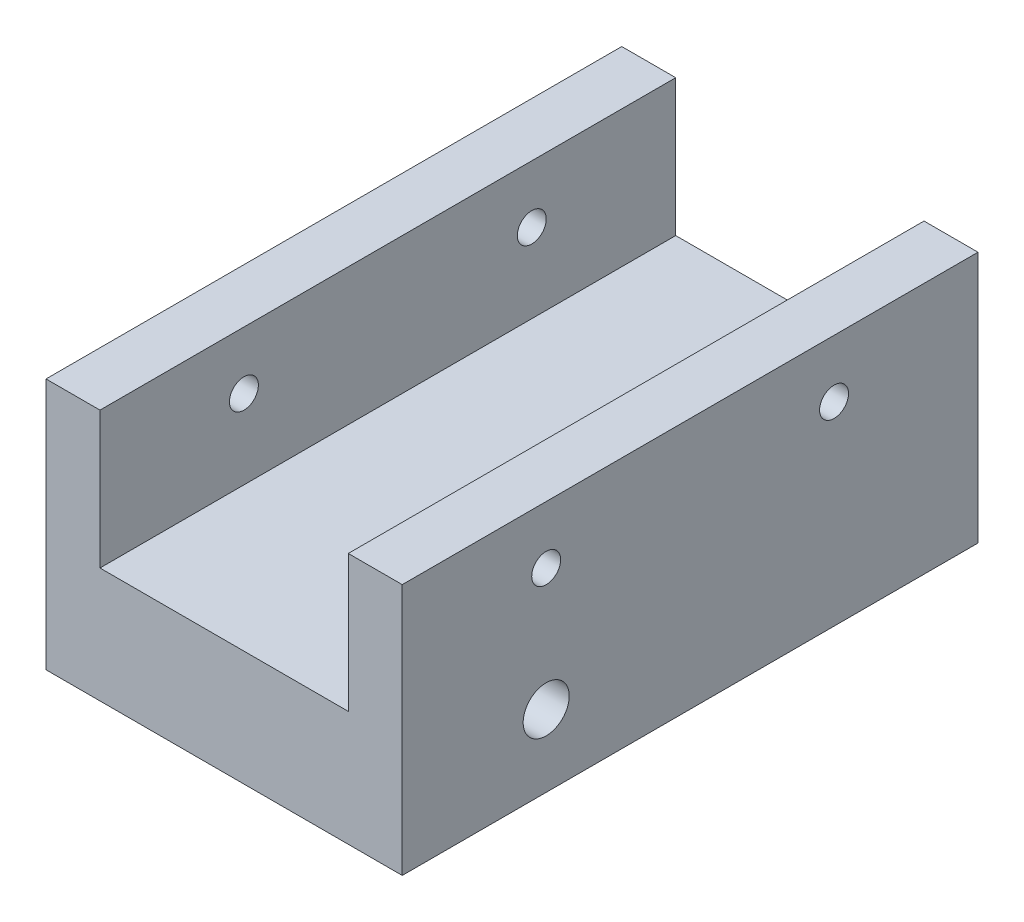
ISO-10303-21;
HEADER;
FILE_DESCRIPTION(('STEP AP214'),'2;1');
FILE_NAME('part.step','',(''),(''),'','','');
FILE_SCHEMA(('AUTOMOTIVE_DESIGN { 1 0 10303 214 1 1 1 1 }'));
ENDSEC;
DATA;
#1=APPLICATION_CONTEXT('core data for automotive mechanical design processes');
#2=APPLICATION_PROTOCOL_DEFINITION('international standard','automotive_design',2000,#1);
#3=PRODUCT_CONTEXT('',#1,'mechanical');
#4=PRODUCT('Part','Part','',(#3));
#5=PRODUCT_RELATED_PRODUCT_CATEGORY('part','',(#4));
#6=PRODUCT_DEFINITION_FORMATION('','',#4);
#7=PRODUCT_DEFINITION_CONTEXT('part definition',#1,'design');
#8=PRODUCT_DEFINITION('design','',#6,#7);
#9=PRODUCT_DEFINITION_SHAPE('','',#8);
#10=(LENGTH_UNIT() NAMED_UNIT(*) SI_UNIT(.MILLI.,.METRE.));
#11=(NAMED_UNIT(*) PLANE_ANGLE_UNIT() SI_UNIT($,.RADIAN.));
#12=(NAMED_UNIT(*) SI_UNIT($,.STERADIAN.) SOLID_ANGLE_UNIT());
#13=UNCERTAINTY_MEASURE_WITH_UNIT(LENGTH_MEASURE(1.E-05),#10,'distance_accuracy_value','');
#14=(GEOMETRIC_REPRESENTATION_CONTEXT(3) GLOBAL_UNCERTAINTY_ASSIGNED_CONTEXT((#13)) GLOBAL_UNIT_ASSIGNED_CONTEXT((#10,
#11,#12)) REPRESENTATION_CONTEXT('',''));
#15=CARTESIAN_POINT('',(0.,0.,0.));
#16=DIRECTION('',(0.,0.,1.));
#17=DIRECTION('',(1.,0.,0.));
#18=AXIS2_PLACEMENT_3D('',#15,#16,#17);
#19=CARTESIAN_POINT('',(0.,44.45,101.6));
#20=DIRECTION('',(1.,0.,0.));
#21=DIRECTION('',(0.,1.,0.));
#22=AXIS2_PLACEMENT_3D('',#19,#20,#21);
#23=PLANE('',#22);
#24=CARTESIAN_POINT('',(0.,12.7,76.2));
#25=DIRECTION('',(-1.,0.,0.));
#26=DIRECTION('',(0.,0.,1.));
#27=AXIS2_PLACEMENT_3D('',#24,#25,#26);
#28=CIRCLE('',#27,4.064);
#29=CARTESIAN_POINT('',(0.,12.7,80.264));
#30=VERTEX_POINT('',#29);
#31=EDGE_CURVE('E218',#30,#30,#28,.T.);
#32=ORIENTED_EDGE('',*,*,#31,.F.);
#33=EDGE_LOOP('',(#32));
#34=FACE_BOUND('',#33,.T.);
#35=CARTESIAN_POINT('',(0.,34.29,25.4));
#36=DIRECTION('',(-1.,0.,0.));
#37=DIRECTION('',(0.,0.,1.));
#38=AXIS2_PLACEMENT_3D('',#35,#36,#37);
#39=CIRCLE('',#38,2.5527);
#40=CARTESIAN_POINT('',(0.,34.29,27.9527));
#41=VERTEX_POINT('',#40);
#42=EDGE_CURVE('E222',#41,#41,#39,.T.);
#43=ORIENTED_EDGE('',*,*,#42,.F.);
#44=EDGE_LOOP('',(#43));
#45=FACE_BOUND('',#44,.T.);
#46=CARTESIAN_POINT('',(0.,34.29,76.2));
#47=DIRECTION('',(-1.,0.,0.));
#48=DIRECTION('',(0.,0.,1.));
#49=AXIS2_PLACEMENT_3D('',#46,#47,#48);
#50=CIRCLE('',#49,2.5527);
#51=CARTESIAN_POINT('',(0.,34.29,78.7527));
#52=VERTEX_POINT('',#51);
#53=EDGE_CURVE('E166',#52,#52,#50,.T.);
#54=ORIENTED_EDGE('',*,*,#53,.F.);
#55=EDGE_LOOP('',(#54));
#56=FACE_BOUND('',#55,.T.);
#57=DIRECTION('',(0.,-1.,0.));
#58=VECTOR('',#57,1.);
#59=CARTESIAN_POINT('',(0.,44.45,0.));
#60=LINE('',#59,#58);
#61=CARTESIAN_POINT('',(0.,44.45,0.));
#62=VERTEX_POINT('',#61);
#63=CARTESIAN_POINT('',(0.,0.,0.));
#64=VERTEX_POINT('',#63);
#65=EDGE_CURVE('E132',#62,#64,#60,.T.);
#66=ORIENTED_EDGE('',*,*,#65,.T.);
#67=DIRECTION('',(0.,0.,-1.));
#68=VECTOR('',#67,1.);
#69=CARTESIAN_POINT('',(0.,0.,101.6));
#70=LINE('',#69,#68);
#71=CARTESIAN_POINT('',(0.,0.,101.6));
#72=VERTEX_POINT('',#71);
#73=EDGE_CURVE('E11',#72,#64,#70,.T.);
#74=ORIENTED_EDGE('',*,*,#73,.F.);
#75=DIRECTION('',(0.,-1.,0.));
#76=VECTOR('',#75,1.);
#77=CARTESIAN_POINT('',(0.,44.45,101.6));
#78=LINE('',#77,#76);
#79=CARTESIAN_POINT('',(0.,44.45,101.6));
#80=VERTEX_POINT('',#79);
#81=EDGE_CURVE('E147',#80,#72,#78,.T.);
#82=ORIENTED_EDGE('',*,*,#81,.F.);
#83=DIRECTION('',(0.,0.,-1.));
#84=VECTOR('',#83,1.);
#85=CARTESIAN_POINT('',(0.,44.45,101.6));
#86=LINE('',#85,#84);
#87=EDGE_CURVE('E128',#80,#62,#86,.T.);
#88=ORIENTED_EDGE('',*,*,#87,.T.);
#89=EDGE_LOOP('',(#66,#74,#82,#88));
#90=FACE_BOUND('',#89,.T.);
#91=ADVANCED_FACE('F34',(#34,#45,#56,#90),#23,.F.);
#92=CARTESIAN_POINT('',(0.,0.,101.6));
#93=DIRECTION('',(0.,1.,0.));
#94=DIRECTION('',(-1.,0.,0.));
#95=AXIS2_PLACEMENT_3D('',#92,#93,#94);
#96=PLANE('',#95);
#97=DIRECTION('',(1.,0.,0.));
#98=VECTOR('',#97,1.);
#99=CARTESIAN_POINT('',(0.,0.,0.));
#100=LINE('',#99,#98);
#101=CARTESIAN_POINT('',(62.865,0.,0.));
#102=VERTEX_POINT('',#101);
#103=EDGE_CURVE('E135',#64,#102,#100,.T.);
#104=ORIENTED_EDGE('',*,*,#103,.T.);
#105=DIRECTION('',(0.,0.,-1.));
#106=VECTOR('',#105,1.);
#107=CARTESIAN_POINT('',(62.865,0.,101.6));
#108=LINE('',#107,#106);
#109=CARTESIAN_POINT('',(62.865,0.,101.6));
#110=VERTEX_POINT('',#109);
#111=EDGE_CURVE('E43',#110,#102,#108,.T.);
#112=ORIENTED_EDGE('',*,*,#111,.F.);
#113=DIRECTION('',(1.,0.,0.));
#114=VECTOR('',#113,1.);
#115=CARTESIAN_POINT('',(0.,0.,101.6));
#116=LINE('',#115,#114);
#117=EDGE_CURVE('E95',#72,#110,#116,.T.);
#118=ORIENTED_EDGE('',*,*,#117,.F.);
#119=ORIENTED_EDGE('',*,*,#73,.T.);
#120=EDGE_LOOP('',(#104,#112,#118,#119));
#121=FACE_BOUND('',#120,.T.);
#122=ADVANCED_FACE('F209',(#121),#96,.F.);
#123=CARTESIAN_POINT('',(62.865,0.,101.6));
#124=DIRECTION('',(-1.,0.,0.));
#125=DIRECTION('',(0.,-1.,0.));
#126=AXIS2_PLACEMENT_3D('',#123,#124,#125);
#127=PLANE('',#126);
#128=CARTESIAN_POINT('',(62.865,12.7,76.2));
#129=DIRECTION('',(-1.,0.,0.));
#130=DIRECTION('',(0.,0.,1.));
#131=AXIS2_PLACEMENT_3D('',#128,#129,#130);
#132=CIRCLE('',#131,4.064);
#133=CARTESIAN_POINT('',(62.865,12.7,80.264));
#134=VERTEX_POINT('',#133);
#135=EDGE_CURVE('E255',#134,#134,#132,.T.);
#136=ORIENTED_EDGE('',*,*,#135,.T.);
#137=EDGE_LOOP('',(#136));
#138=FACE_BOUND('',#137,.T.);
#139=CARTESIAN_POINT('',(62.865,34.29,25.4));
#140=DIRECTION('',(-1.,0.,0.));
#141=DIRECTION('',(0.,0.,1.));
#142=AXIS2_PLACEMENT_3D('',#139,#140,#141);
#143=CIRCLE('',#142,2.55269999999998);
#144=CARTESIAN_POINT('',(62.865,34.29,27.9527));
#145=VERTEX_POINT('',#144);
#146=EDGE_CURVE('E260',#145,#145,#143,.T.);
#147=ORIENTED_EDGE('',*,*,#146,.T.);
#148=EDGE_LOOP('',(#147));
#149=FACE_BOUND('',#148,.T.);
#150=CARTESIAN_POINT('',(62.865,34.29,76.2));
#151=DIRECTION('',(-1.,0.,0.));
#152=DIRECTION('',(0.,0.,1.));
#153=AXIS2_PLACEMENT_3D('',#150,#151,#152);
#154=CIRCLE('',#153,2.55269999999998);
#155=CARTESIAN_POINT('',(62.865,34.29,78.7527));
#156=VERTEX_POINT('',#155);
#157=EDGE_CURVE('E160',#156,#156,#154,.T.);
#158=ORIENTED_EDGE('',*,*,#157,.T.);
#159=EDGE_LOOP('',(#158));
#160=FACE_BOUND('',#159,.T.);
#161=DIRECTION('',(0.,1.,0.));
#162=VECTOR('',#161,1.);
#163=CARTESIAN_POINT('',(62.865,0.,0.));
#164=LINE('',#163,#162);
#165=CARTESIAN_POINT('',(62.865,44.45,0.));
#166=VERTEX_POINT('',#165);
#167=EDGE_CURVE('E138',#102,#166,#164,.T.);
#168=ORIENTED_EDGE('',*,*,#167,.T.);
#169=DIRECTION('',(0.,0.,-1.));
#170=VECTOR('',#169,1.);
#171=CARTESIAN_POINT('',(62.865,44.45,101.6));
#172=LINE('',#171,#170);
#173=CARTESIAN_POINT('',(62.865,44.45,101.6));
#174=VERTEX_POINT('',#173);
#175=EDGE_CURVE('E154',#174,#166,#172,.T.);
#176=ORIENTED_EDGE('',*,*,#175,.F.);
#177=DIRECTION('',(0.,1.,0.));
#178=VECTOR('',#177,1.);
#179=CARTESIAN_POINT('',(62.865,0.,101.6));
#180=LINE('',#179,#178);
#181=EDGE_CURVE('E177',#110,#174,#180,.T.);
#182=ORIENTED_EDGE('',*,*,#181,.F.);
#183=ORIENTED_EDGE('',*,*,#111,.T.);
#184=EDGE_LOOP('',(#168,#176,#182,#183));
#185=FACE_BOUND('',#184,.T.);
#186=ADVANCED_FACE('F214',(#138,#149,#160,#185),#127,.F.);
#187=CARTESIAN_POINT('',(62.865,44.45,101.6));
#188=DIRECTION('',(0.,-1.,0.));
#189=DIRECTION('',(0.,0.,-1.));
#190=AXIS2_PLACEMENT_3D('',#187,#188,#189);
#191=PLANE('',#190);
#192=DIRECTION('',(-1.,0.,0.));
#193=VECTOR('',#192,1.);
#194=CARTESIAN_POINT('',(62.865,44.45,0.));
#195=LINE('',#194,#193);
#196=CARTESIAN_POINT('',(53.34,44.45,0.));
#197=VERTEX_POINT('',#196);
#198=EDGE_CURVE('E140',#166,#197,#195,.T.);
#199=ORIENTED_EDGE('',*,*,#198,.T.);
#200=DIRECTION('',(0.,0.,-1.));
#201=VECTOR('',#200,1.);
#202=CARTESIAN_POINT('',(53.34,44.45,101.6));
#203=LINE('',#202,#201);
#204=CARTESIAN_POINT('',(53.34,44.45,101.6));
#205=VERTEX_POINT('',#204);
#206=EDGE_CURVE('E151',#205,#197,#203,.T.);
#207=ORIENTED_EDGE('',*,*,#206,.F.);
#208=DIRECTION('',(-1.,0.,0.));
#209=VECTOR('',#208,1.);
#210=CARTESIAN_POINT('',(62.865,44.45,101.6));
#211=LINE('',#210,#209);
#212=EDGE_CURVE('E179',#174,#205,#211,.T.);
#213=ORIENTED_EDGE('',*,*,#212,.F.);
#214=ORIENTED_EDGE('',*,*,#175,.T.);
#215=EDGE_LOOP('',(#199,#207,#213,#214));
#216=FACE_BOUND('',#215,.T.);
#217=ADVANCED_FACE('F185',(#216),#191,.F.);
#218=CARTESIAN_POINT('',(53.34,44.45,101.6));
#219=DIRECTION('',(1.,0.,0.));
#220=DIRECTION('',(0.,0.,-1.));
#221=AXIS2_PLACEMENT_3D('',#218,#219,#220);
#222=PLANE('',#221);
#223=CARTESIAN_POINT('',(53.34,34.29,25.4));
#224=DIRECTION('',(1.,0.,0.));
#225=DIRECTION('',(0.,0.,-1.));
#226=AXIS2_PLACEMENT_3D('',#223,#224,#225);
#227=CIRCLE('',#226,2.55269999999999);
#228=CARTESIAN_POINT('',(53.34,34.29,22.8473));
#229=VERTEX_POINT('',#228);
#230=EDGE_CURVE('E37',#229,#229,#227,.T.);
#231=ORIENTED_EDGE('',*,*,#230,.T.);
#232=EDGE_LOOP('',(#231));
#233=FACE_BOUND('',#232,.T.);
#234=CARTESIAN_POINT('',(53.34,34.29,76.2));
#235=DIRECTION('',(1.,0.,0.));
#236=DIRECTION('',(0.,0.,-1.));
#237=AXIS2_PLACEMENT_3D('',#234,#235,#236);
#238=CIRCLE('',#237,2.55269999999999);
#239=CARTESIAN_POINT('',(53.34,34.29,73.6473));
#240=VERTEX_POINT('',#239);
#241=EDGE_CURVE('E158',#240,#240,#238,.T.);
#242=ORIENTED_EDGE('',*,*,#241,.T.);
#243=EDGE_LOOP('',(#242));
#244=FACE_BOUND('',#243,.T.);
#245=DIRECTION('',(0.,-1.,0.));
#246=VECTOR('',#245,1.);
#247=CARTESIAN_POINT('',(53.34,44.45,0.));
#248=LINE('',#247,#246);
#249=CARTESIAN_POINT('',(53.34,20.32,0.));
#250=VERTEX_POINT('',#249);
#251=EDGE_CURVE('E142',#197,#250,#248,.T.);
#252=ORIENTED_EDGE('',*,*,#251,.T.);
#253=DIRECTION('',(0.,0.,-1.));
#254=VECTOR('',#253,1.);
#255=CARTESIAN_POINT('',(53.34,20.32,101.6));
#256=LINE('',#255,#254);
#257=CARTESIAN_POINT('',(53.34,20.32,101.6));
#258=VERTEX_POINT('',#257);
#259=EDGE_CURVE('E123',#258,#250,#256,.T.);
#260=ORIENTED_EDGE('',*,*,#259,.F.);
#261=DIRECTION('',(0.,-1.,0.));
#262=VECTOR('',#261,1.);
#263=CARTESIAN_POINT('',(53.34,44.45,101.6));
#264=LINE('',#263,#262);
#265=EDGE_CURVE('E114',#205,#258,#264,.T.);
#266=ORIENTED_EDGE('',*,*,#265,.F.);
#267=ORIENTED_EDGE('',*,*,#206,.T.);
#268=EDGE_LOOP('',(#252,#260,#266,#267));
#269=FACE_BOUND('',#268,.T.);
#270=ADVANCED_FACE('F189',(#233,#244,#269),#222,.F.);
#271=CARTESIAN_POINT('',(53.34,20.32,101.6));
#272=DIRECTION('',(0.,-1.,0.));
#273=DIRECTION('',(0.,0.,-1.));
#274=AXIS2_PLACEMENT_3D('',#271,#272,#273);
#275=PLANE('',#274);
#276=DIRECTION('',(-1.,0.,0.));
#277=VECTOR('',#276,1.);
#278=CARTESIAN_POINT('',(53.34,20.32,0.));
#279=LINE('',#278,#277);
#280=CARTESIAN_POINT('',(9.52500000000001,20.32,0.));
#281=VERTEX_POINT('',#280);
#282=EDGE_CURVE('E122',#250,#281,#279,.T.);
#283=ORIENTED_EDGE('',*,*,#282,.T.);
#284=DIRECTION('',(0.,0.,-1.));
#285=VECTOR('',#284,1.);
#286=CARTESIAN_POINT('',(9.52500000000001,20.32,101.6));
#287=LINE('',#286,#285);
#288=CARTESIAN_POINT('',(9.52500000000001,20.32,101.6));
#289=VERTEX_POINT('',#288);
#290=EDGE_CURVE('E119',#289,#281,#287,.T.);
#291=ORIENTED_EDGE('',*,*,#290,.F.);
#292=DIRECTION('',(-1.,0.,0.));
#293=VECTOR('',#292,1.);
#294=CARTESIAN_POINT('',(53.34,20.32,101.6));
#295=LINE('',#294,#293);
#296=EDGE_CURVE('E108',#258,#289,#295,.T.);
#297=ORIENTED_EDGE('',*,*,#296,.F.);
#298=ORIENTED_EDGE('',*,*,#259,.T.);
#299=EDGE_LOOP('',(#283,#291,#297,#298));
#300=FACE_BOUND('',#299,.T.);
#301=ADVANCED_FACE('F120',(#300),#275,.F.);
#302=CARTESIAN_POINT('',(9.52500000000001,44.45,101.6));
#303=DIRECTION('',(-1.,0.,0.));
#304=DIRECTION('',(0.,-1.,0.));
#305=AXIS2_PLACEMENT_3D('',#302,#303,#304);
#306=PLANE('',#305);
#307=CARTESIAN_POINT('',(9.52500000000001,34.29,25.4));
#308=DIRECTION('',(-1.,0.,0.));
#309=DIRECTION('',(0.,-1.,0.));
#310=AXIS2_PLACEMENT_3D('',#307,#308,#309);
#311=CIRCLE('',#310,2.55269999999999);
#312=CARTESIAN_POINT('',(9.52500000000001,31.7373,25.4));
#313=VERTEX_POINT('',#312);
#314=EDGE_CURVE('E171',#313,#313,#311,.T.);
#315=ORIENTED_EDGE('',*,*,#314,.T.);
#316=EDGE_LOOP('',(#315));
#317=FACE_BOUND('',#316,.T.);
#318=CARTESIAN_POINT('',(9.52500000000001,34.29,76.2));
#319=DIRECTION('',(-1.,0.,0.));
#320=DIRECTION('',(0.,-1.,0.));
#321=AXIS2_PLACEMENT_3D('',#318,#319,#320);
#322=CIRCLE('',#321,2.55269999999999);
#323=CARTESIAN_POINT('',(9.52500000000001,31.7373,76.2));
#324=VERTEX_POINT('',#323);
#325=EDGE_CURVE('E136',#324,#324,#322,.T.);
#326=ORIENTED_EDGE('',*,*,#325,.T.);
#327=EDGE_LOOP('',(#326));
#328=FACE_BOUND('',#327,.T.);
#329=DIRECTION('',(0.,1.,0.));
#330=VECTOR('',#329,1.);
#331=CARTESIAN_POINT('',(9.52500000000001,44.45,0.));
#332=LINE('',#331,#330);
#333=CARTESIAN_POINT('',(9.52500000000001,44.45,0.));
#334=VERTEX_POINT('',#333);
#335=EDGE_CURVE('E81',#281,#334,#332,.T.);
#336=ORIENTED_EDGE('',*,*,#335,.T.);
#337=DIRECTION('',(0.,0.,-1.));
#338=VECTOR('',#337,1.);
#339=CARTESIAN_POINT('',(9.52500000000001,44.45,101.6));
#340=LINE('',#339,#338);
#341=CARTESIAN_POINT('',(9.52500000000001,44.45,101.6));
#342=VERTEX_POINT('',#341);
#343=EDGE_CURVE('E124',#342,#334,#340,.T.);
#344=ORIENTED_EDGE('',*,*,#343,.F.);
#345=DIRECTION('',(0.,1.,0.));
#346=VECTOR('',#345,1.);
#347=CARTESIAN_POINT('',(9.52500000000001,44.45,101.6));
#348=LINE('',#347,#346);
#349=EDGE_CURVE('E112',#289,#342,#348,.T.);
#350=ORIENTED_EDGE('',*,*,#349,.F.);
#351=ORIENTED_EDGE('',*,*,#290,.T.);
#352=EDGE_LOOP('',(#336,#344,#350,#351));
#353=FACE_BOUND('',#352,.T.);
#354=ADVANCED_FACE('F126',(#317,#328,#353),#306,.F.);
#355=CARTESIAN_POINT('',(9.52500000000001,44.45,101.6));
#356=DIRECTION('',(0.,-1.,0.));
#357=DIRECTION('',(0.,0.,-1.));
#358=AXIS2_PLACEMENT_3D('',#355,#356,#357);
#359=PLANE('',#358);
#360=DIRECTION('',(-1.,0.,0.));
#361=VECTOR('',#360,1.);
#362=CARTESIAN_POINT('',(9.52500000000001,44.45,0.));
#363=LINE('',#362,#361);
#364=EDGE_CURVE('E87',#334,#62,#363,.T.);
#365=ORIENTED_EDGE('',*,*,#364,.T.);
#366=ORIENTED_EDGE('',*,*,#87,.F.);
#367=DIRECTION('',(-1.,0.,0.));
#368=VECTOR('',#367,1.);
#369=CARTESIAN_POINT('',(9.52500000000001,44.45,101.6));
#370=LINE('',#369,#368);
#371=EDGE_CURVE('E52',#342,#80,#370,.T.);
#372=ORIENTED_EDGE('',*,*,#371,.F.);
#373=ORIENTED_EDGE('',*,*,#343,.T.);
#374=EDGE_LOOP('',(#365,#366,#372,#373));
#375=FACE_BOUND('',#374,.T.);
#376=ADVANCED_FACE('F197',(#375),#359,.F.);
#377=CARTESIAN_POINT('',(0.,0.,101.6));
#378=DIRECTION('',(0.,0.,1.));
#379=DIRECTION('',(1.,0.,0.));
#380=AXIS2_PLACEMENT_3D('',#377,#378,#379);
#381=PLANE('',#380);
#382=ORIENTED_EDGE('',*,*,#81,.T.);
#383=ORIENTED_EDGE('',*,*,#117,.T.);
#384=ORIENTED_EDGE('',*,*,#181,.T.);
#385=ORIENTED_EDGE('',*,*,#212,.T.);
#386=ORIENTED_EDGE('',*,*,#265,.T.);
#387=ORIENTED_EDGE('',*,*,#296,.T.);
#388=ORIENTED_EDGE('',*,*,#349,.T.);
#389=ORIENTED_EDGE('',*,*,#371,.T.);
#390=EDGE_LOOP('',(#382,#383,#384,#385,#386,#387,#388,#389));
#391=FACE_BOUND('',#390,.T.);
#392=ADVANCED_FACE('F110',(#391),#381,.T.);
#393=CARTESIAN_POINT('',(0.,0.,0.));
#394=DIRECTION('',(0.,0.,1.));
#395=DIRECTION('',(1.,0.,0.));
#396=AXIS2_PLACEMENT_3D('',#393,#394,#395);
#397=PLANE('',#396);
#398=CARTESIAN_POINT('',(31.4325,12.7,0.));
#399=DIRECTION('',(0.,0.,-1.));
#400=DIRECTION('',(-1.,0.,0.));
#401=AXIS2_PLACEMENT_3D('',#398,#399,#400);
#402=CIRCLE('',#401,3.81);
#403=CARTESIAN_POINT('',(27.6225,12.7,0.));
#404=VERTEX_POINT('',#403);
#405=EDGE_CURVE('E248',#404,#404,#402,.T.);
#406=ORIENTED_EDGE('',*,*,#405,.F.);
#407=EDGE_LOOP('',(#406));
#408=FACE_BOUND('',#407,.T.);
#409=ORIENTED_EDGE('',*,*,#65,.F.);
#410=ORIENTED_EDGE('',*,*,#364,.F.);
#411=ORIENTED_EDGE('',*,*,#335,.F.);
#412=ORIENTED_EDGE('',*,*,#282,.F.);
#413=ORIENTED_EDGE('',*,*,#251,.F.);
#414=ORIENTED_EDGE('',*,*,#198,.F.);
#415=ORIENTED_EDGE('',*,*,#167,.F.);
#416=ORIENTED_EDGE('',*,*,#103,.F.);
#417=EDGE_LOOP('',(#409,#410,#411,#412,#413,#414,#415,#416));
#418=FACE_BOUND('',#417,.T.);
#419=ADVANCED_FACE('F192',(#408,#418),#397,.F.);
#420=CARTESIAN_POINT('',(0.,34.29,76.2));
#421=DIRECTION('',(-1.,0.,0.));
#422=DIRECTION('',(0.,0.,1.));
#423=AXIS2_PLACEMENT_3D('',#420,#421,#422);
#424=CYLINDRICAL_SURFACE('',#423,2.55269999999999);
#425=ORIENTED_EDGE('',*,*,#157,.F.);
#426=EDGE_LOOP('',(#425));
#427=FACE_BOUND('',#426,.T.);
#428=ORIENTED_EDGE('',*,*,#241,.F.);
#429=EDGE_LOOP('',(#428));
#430=FACE_BOUND('',#429,.T.);
#431=ADVANCED_FACE('F229',(#427,#430),#424,.F.);
#432=ORIENTED_EDGE('',*,*,#53,.T.);
#433=EDGE_LOOP('',(#432));
#434=FACE_BOUND('',#433,.T.);
#435=ORIENTED_EDGE('',*,*,#325,.F.);
#436=EDGE_LOOP('',(#435));
#437=FACE_BOUND('',#436,.T.);
#438=ADVANCED_FACE('F225',(#434,#437),#424,.F.);
#439=CARTESIAN_POINT('',(0.,34.29,25.4));
#440=DIRECTION('',(-1.,0.,0.));
#441=DIRECTION('',(0.,0.,1.));
#442=AXIS2_PLACEMENT_3D('',#439,#440,#441);
#443=CYLINDRICAL_SURFACE('',#442,2.55269999999999);
#444=ORIENTED_EDGE('',*,*,#146,.F.);
#445=EDGE_LOOP('',(#444));
#446=FACE_BOUND('',#445,.T.);
#447=ORIENTED_EDGE('',*,*,#230,.F.);
#448=EDGE_LOOP('',(#447));
#449=FACE_BOUND('',#448,.T.);
#450=ADVANCED_FACE('F228',(#446,#449),#443,.F.);
#451=ORIENTED_EDGE('',*,*,#42,.T.);
#452=EDGE_LOOP('',(#451));
#453=FACE_BOUND('',#452,.T.);
#454=ORIENTED_EDGE('',*,*,#314,.F.);
#455=EDGE_LOOP('',(#454));
#456=FACE_BOUND('',#455,.T.);
#457=ADVANCED_FACE('F237',(#453,#456),#443,.F.);
#458=CARTESIAN_POINT('',(62.865,12.7,76.2));
#459=DIRECTION('',(-1.,0.,0.));
#460=DIRECTION('',(0.,0.,1.));
#461=AXIS2_PLACEMENT_3D('',#458,#459,#460);
#462=CYLINDRICAL_SURFACE('',#461,4.064);
#463=ORIENTED_EDGE('',*,*,#135,.F.);
#464=EDGE_LOOP('',(#463));
#465=FACE_BOUND('',#464,.T.);
#466=ORIENTED_EDGE('',*,*,#31,.T.);
#467=EDGE_LOOP('',(#466));
#468=FACE_BOUND('',#467,.T.);
#469=ADVANCED_FACE('F286',(#465,#468),#462,.F.);
#470=CARTESIAN_POINT('',(31.4325,12.7,38.1));
#471=DIRECTION('',(0.,0.,-1.));
#472=DIRECTION('',(-1.,0.,0.));
#473=AXIS2_PLACEMENT_3D('',#470,#471,#472);
#474=CYLINDRICAL_SURFACE('',#473,3.81);
#475=CARTESIAN_POINT('',(31.4325,12.7,38.1));
#476=DIRECTION('',(0.,0.,-1.));
#477=DIRECTION('',(-1.,0.,0.));
#478=AXIS2_PLACEMENT_3D('',#475,#476,#477);
#479=CIRCLE('',#478,3.81);
#480=CARTESIAN_POINT('',(27.6225,12.7,38.1));
#481=VERTEX_POINT('',#480);
#482=EDGE_CURVE('E250',#481,#481,#479,.T.);
#483=CARTESIAN_POINT('',(27.6225,12.7,38.1));
#484=CARTESIAN_POINT('',(27.6225,12.7,37.703125));
#485=CARTESIAN_POINT('',(27.6225,12.7,37.30625));
#486=CARTESIAN_POINT('',(27.6225,12.7,36.5125));
#487=CARTESIAN_POINT('',(27.6225,12.7,36.115625));
#488=CARTESIAN_POINT('',(27.6225,12.7,35.321875));
#489=CARTESIAN_POINT('',(27.6225,12.7,34.925));
#490=CARTESIAN_POINT('',(27.6225,12.7,34.13125));
#491=CARTESIAN_POINT('',(27.6225,12.7,33.734375));
#492=CARTESIAN_POINT('',(27.6225,12.7,32.940625));
#493=CARTESIAN_POINT('',(27.6225,12.7,32.54375));
#494=CARTESIAN_POINT('',(27.6225,12.7,31.75));
#495=CARTESIAN_POINT('',(27.6225,12.7,31.353125));
#496=CARTESIAN_POINT('',(27.6225,12.7,30.559375));
#497=CARTESIAN_POINT('',(27.6225,12.7,30.1625));
#498=CARTESIAN_POINT('',(27.6225,12.7,29.36875));
#499=CARTESIAN_POINT('',(27.6225,12.7,28.971875));
#500=CARTESIAN_POINT('',(27.6225,12.7,28.178125));
#501=CARTESIAN_POINT('',(27.6225,12.7,27.78125));
#502=CARTESIAN_POINT('',(27.6225,12.7,26.9875));
#503=CARTESIAN_POINT('',(27.6225,12.7,26.590625));
#504=CARTESIAN_POINT('',(27.6225,12.7,25.796875));
#505=CARTESIAN_POINT('',(27.6225,12.7,25.4));
#506=CARTESIAN_POINT('',(27.6225,12.7,24.60625));
#507=CARTESIAN_POINT('',(27.6225,12.7,24.209375));
#508=CARTESIAN_POINT('',(27.6225,12.7,23.415625));
#509=CARTESIAN_POINT('',(27.6225,12.7,23.01875));
#510=CARTESIAN_POINT('',(27.6225,12.7,22.225));
#511=CARTESIAN_POINT('',(27.6225,12.7,21.828125));
#512=CARTESIAN_POINT('',(27.6225,12.7,21.034375));
#513=CARTESIAN_POINT('',(27.6225,12.7,20.6375));
#514=CARTESIAN_POINT('',(27.6225,12.7,19.84375));
#515=CARTESIAN_POINT('',(27.6225,12.7,19.446875));
#516=CARTESIAN_POINT('',(27.6225,12.7,18.653125));
#517=CARTESIAN_POINT('',(27.6225,12.7,18.25625));
#518=CARTESIAN_POINT('',(27.6225,12.7,17.4625));
#519=CARTESIAN_POINT('',(27.6225,12.7,17.065625));
#520=CARTESIAN_POINT('',(27.6225,12.7,16.271875));
#521=CARTESIAN_POINT('',(27.6225,12.7,15.875));
#522=CARTESIAN_POINT('',(27.6225,12.7,15.08125));
#523=CARTESIAN_POINT('',(27.6225,12.7,14.684375));
#524=CARTESIAN_POINT('',(27.6225,12.7,13.890625));
#525=CARTESIAN_POINT('',(27.6225,12.7,13.49375));
#526=CARTESIAN_POINT('',(27.6225,12.7,12.7));
#527=CARTESIAN_POINT('',(27.6225,12.7,12.303125));
#528=CARTESIAN_POINT('',(27.6225,12.7,11.509375));
#529=CARTESIAN_POINT('',(27.6225,12.7,11.1125));
#530=CARTESIAN_POINT('',(27.6225,12.7,10.31875));
#531=CARTESIAN_POINT('',(27.6225,12.7,9.921875));
#532=CARTESIAN_POINT('',(27.6225,12.7,9.128125));
#533=CARTESIAN_POINT('',(27.6225,12.7,8.73125));
#534=CARTESIAN_POINT('',(27.6225,12.7,7.9375));
#535=CARTESIAN_POINT('',(27.6225,12.7,7.540625));
#536=CARTESIAN_POINT('',(27.6225,12.7,6.746875));
#537=CARTESIAN_POINT('',(27.6225,12.7,6.35));
#538=CARTESIAN_POINT('',(27.6225,12.7,5.55625));
#539=CARTESIAN_POINT('',(27.6225,12.7,5.159375));
#540=CARTESIAN_POINT('',(27.6225,12.7,4.365625));
#541=CARTESIAN_POINT('',(27.6225,12.7,3.96875));
#542=CARTESIAN_POINT('',(27.6225,12.7,3.175));
#543=CARTESIAN_POINT('',(27.6225,12.7,2.778125));
#544=CARTESIAN_POINT('',(27.6225,12.7,1.984375));
#545=CARTESIAN_POINT('',(27.6225,12.7,1.5875));
#546=CARTESIAN_POINT('',(27.6225,12.7,0.79375));
#547=CARTESIAN_POINT('',(27.6225,12.7,0.396875));
#548=CARTESIAN_POINT('',(27.6225,12.7,0.));
#549=B_SPLINE_CURVE_WITH_KNOTS('',3,(#483,#484,#485,#486,#487,#488,#489,#490,#491,#492,#493,
#494,#495,#496,#497,#498,#499,#500,#501,#502,#503,#504,#505,#506,#507,#508,#509,#510,#511,#512,
#513,#514,#515,#516,#517,#518,#519,#520,#521,#522,#523,#524,#525,#526,#527,#528,#529,#530,#531,
#532,#533,#534,#535,#536,#537,#538,#539,#540,#541,#542,#543,#544,#545,#546,#547,#548),
.UNSPECIFIED.,.F.,.F.,(4,2,2,2,2,2,2,2,2,2,2,2,2,2,2,2,2,2,2,2,2,2,2,2,2,2,2,2,2,2,2,2,4),(0.,
1.190625,2.38125,3.571875,4.7625,5.953125,7.14375,8.334375,9.52500000000001,10.715625,11.90625,
13.096875,14.2875,15.478125,16.66875,17.859375,19.05,20.240625,21.43125,22.621875,23.8125,
25.003125,26.19375,27.384375,28.575,29.765625,30.95625,32.146875,33.3375,34.528125,35.71875,
36.909375,38.1),.UNSPECIFIED.);
#550=EDGE_CURVE('BSEAM289',#481,#404,#549,.T.);
#551=ORIENTED_EDGE('',*,*,#482,.F.);
#552=ORIENTED_EDGE('',*,*,#405,.T.);
#553=ORIENTED_EDGE('',*,*,#550,.T.);
#554=ORIENTED_EDGE('',*,*,#550,.F.);
#555=EDGE_LOOP('',(#551,#553,#552,#554));
#556=FACE_BOUND('',#555,.T.);
#557=ADVANCED_FACE('F289',(#556),#474,.F.);
#558=CARTESIAN_POINT('',(31.4325,12.7,38.1));
#559=DIRECTION('',(0.,0.,-1.));
#560=DIRECTION('',(-1.,0.,0.));
#561=AXIS2_PLACEMENT_3D('',#558,#559,#560);
#562=PLANE('',#561);
#563=ORIENTED_EDGE('',*,*,#482,.T.);
#564=EDGE_LOOP('',(#563));
#565=FACE_BOUND('',#564,.T.);
#566=ADVANCED_FACE('F294',(#565),#562,.T.);
#567=CLOSED_SHELL('',(#91,#122,#186,#217,#270,#301,#354,#376,#392,#419,#431,#438,#450,#457,#469,
#557,#566));
#568=MANIFOLD_SOLID_BREP('B2',#567);
#569=ADVANCED_BREP_SHAPE_REPRESENTATION('',(#18,#568),#14);
#570=SHAPE_DEFINITION_REPRESENTATION(#9,#569);
ENDSEC;
END-ISO-10303-21;
